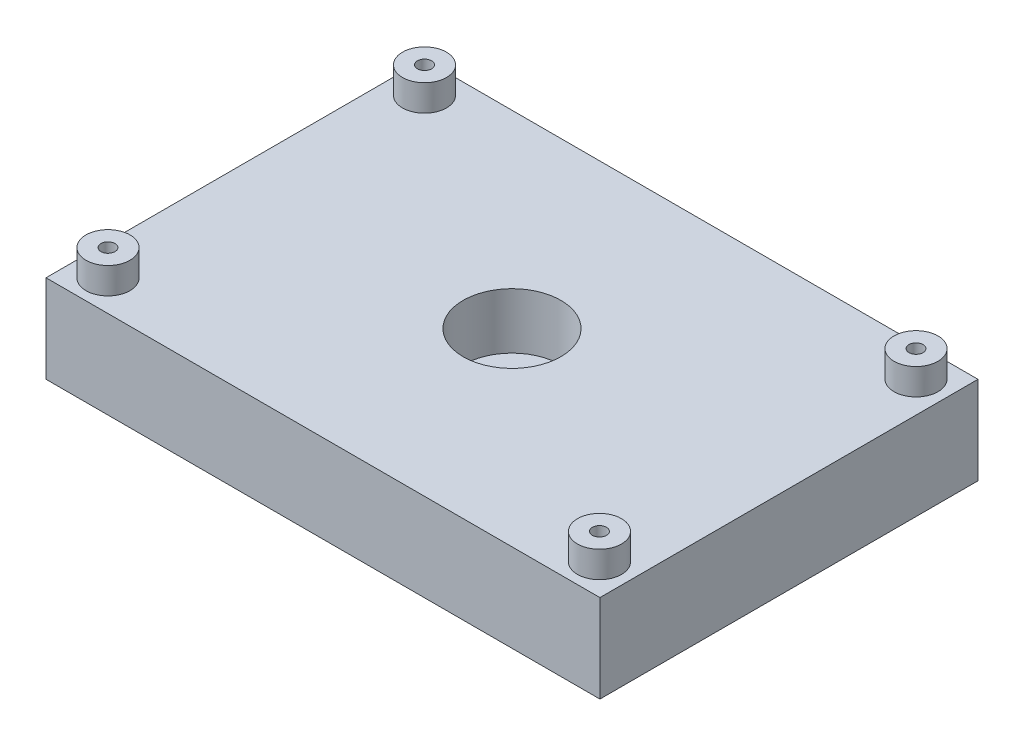
ISO-10303-21;
HEADER;
FILE_DESCRIPTION(('STEP AP214'),'2;1');
FILE_NAME('part.step','',(''),(''),'','','');
FILE_SCHEMA(('AUTOMOTIVE_DESIGN { 1 0 10303 214 1 1 1 1 }'));
ENDSEC;
DATA;
#1=APPLICATION_CONTEXT('core data for automotive mechanical design processes');
#2=APPLICATION_PROTOCOL_DEFINITION('international standard','automotive_design',2000,#1);
#3=PRODUCT_CONTEXT('',#1,'mechanical');
#4=PRODUCT('Part','Part','',(#3));
#5=PRODUCT_RELATED_PRODUCT_CATEGORY('part','',(#4));
#6=PRODUCT_DEFINITION_FORMATION('','',#4);
#7=PRODUCT_DEFINITION_CONTEXT('part definition',#1,'design');
#8=PRODUCT_DEFINITION('design','',#6,#7);
#9=PRODUCT_DEFINITION_SHAPE('','',#8);
#10=(LENGTH_UNIT() NAMED_UNIT(*) SI_UNIT(.MILLI.,.METRE.));
#11=(NAMED_UNIT(*) PLANE_ANGLE_UNIT() SI_UNIT($,.RADIAN.));
#12=(NAMED_UNIT(*) SI_UNIT($,.STERADIAN.) SOLID_ANGLE_UNIT());
#13=UNCERTAINTY_MEASURE_WITH_UNIT(LENGTH_MEASURE(1.E-05),#10,'distance_accuracy_value','');
#14=(GEOMETRIC_REPRESENTATION_CONTEXT(3) GLOBAL_UNCERTAINTY_ASSIGNED_CONTEXT((#13)) GLOBAL_UNIT_ASSIGNED_CONTEXT((#10,
#11,#12)) REPRESENTATION_CONTEXT('',''));
#15=CARTESIAN_POINT('',(0.,0.,0.));
#16=DIRECTION('',(0.,0.,1.));
#17=DIRECTION('',(1.,0.,0.));
#18=AXIS2_PLACEMENT_3D('',#15,#16,#17);
#19=CARTESIAN_POINT('',(-31.5,10.,-21.5));
#20=DIRECTION('',(1.,0.,0.));
#21=DIRECTION('',(0.,0.,-1.));
#22=AXIS2_PLACEMENT_3D('',#19,#20,#21);
#23=PLANE('',#22);
#24=DIRECTION('',(0.,0.,1.));
#25=VECTOR('',#24,1.);
#26=CARTESIAN_POINT('',(-31.5,0.,-21.5));
#27=LINE('',#26,#25);
#28=CARTESIAN_POINT('',(-31.5,0.,-21.5));
#29=VERTEX_POINT('',#28);
#30=CARTESIAN_POINT('',(-31.5,0.,21.5));
#31=VERTEX_POINT('',#30);
#32=EDGE_CURVE('E115',#29,#31,#27,.T.);
#33=ORIENTED_EDGE('',*,*,#32,.T.);
#34=DIRECTION('',(0.,-1.,0.));
#35=VECTOR('',#34,1.);
#36=CARTESIAN_POINT('',(-31.5,10.,21.5));
#37=LINE('',#36,#35);
#38=CARTESIAN_POINT('',(-31.5,10.,21.5));
#39=VERTEX_POINT('',#38);
#40=EDGE_CURVE('E104',#39,#31,#37,.T.);
#41=ORIENTED_EDGE('',*,*,#40,.F.);
#42=DIRECTION('',(0.,0.,1.));
#43=VECTOR('',#42,1.);
#44=CARTESIAN_POINT('',(-31.5,10.,-21.5));
#45=LINE('',#44,#43);
#46=CARTESIAN_POINT('',(-31.5,10.,-21.5));
#47=VERTEX_POINT('',#46);
#48=EDGE_CURVE('E96',#47,#39,#45,.T.);
#49=ORIENTED_EDGE('',*,*,#48,.F.);
#50=DIRECTION('',(0.,-1.,0.));
#51=VECTOR('',#50,1.);
#52=CARTESIAN_POINT('',(-31.5,10.,-21.5));
#53=LINE('',#52,#51);
#54=EDGE_CURVE('E111',#47,#29,#53,.T.);
#55=ORIENTED_EDGE('',*,*,#54,.T.);
#56=EDGE_LOOP('',(#33,#41,#49,#55));
#57=FACE_BOUND('',#56,.T.);
#58=ADVANCED_FACE('F43',(#57),#23,.F.);
#59=CARTESIAN_POINT('',(31.5,10.,21.5));
#60=DIRECTION('',(0.,0.,-1.));
#61=DIRECTION('',(-1.,0.,0.));
#62=AXIS2_PLACEMENT_3D('',#59,#60,#61);
#63=PLANE('',#62);
#64=DIRECTION('',(1.,0.,0.));
#65=VECTOR('',#64,1.);
#66=CARTESIAN_POINT('',(31.5,0.,21.5));
#67=LINE('',#66,#65);
#68=CARTESIAN_POINT('',(31.5,0.,21.5));
#69=VERTEX_POINT('',#68);
#70=EDGE_CURVE('E102',#31,#69,#67,.T.);
#71=ORIENTED_EDGE('',*,*,#70,.T.);
#72=DIRECTION('',(0.,-1.,0.));
#73=VECTOR('',#72,1.);
#74=CARTESIAN_POINT('',(31.5,10.,21.5));
#75=LINE('',#74,#73);
#76=CARTESIAN_POINT('',(31.5,10.,21.5));
#77=VERTEX_POINT('',#76);
#78=EDGE_CURVE('E100',#77,#69,#75,.T.);
#79=ORIENTED_EDGE('',*,*,#78,.F.);
#80=DIRECTION('',(1.,0.,0.));
#81=VECTOR('',#80,1.);
#82=CARTESIAN_POINT('',(31.5,10.,21.5));
#83=LINE('',#82,#81);
#84=EDGE_CURVE('E91',#39,#77,#83,.T.);
#85=ORIENTED_EDGE('',*,*,#84,.F.);
#86=ORIENTED_EDGE('',*,*,#40,.T.);
#87=EDGE_LOOP('',(#71,#79,#85,#86));
#88=FACE_BOUND('',#87,.T.);
#89=ADVANCED_FACE('F101',(#88),#63,.F.);
#90=CARTESIAN_POINT('',(31.5,10.,-21.5));
#91=DIRECTION('',(-1.,0.,0.));
#92=DIRECTION('',(0.,0.,1.));
#93=AXIS2_PLACEMENT_3D('',#90,#91,#92);
#94=PLANE('',#93);
#95=DIRECTION('',(0.,0.,-1.));
#96=VECTOR('',#95,1.);
#97=CARTESIAN_POINT('',(31.5,0.,-21.5));
#98=LINE('',#97,#96);
#99=CARTESIAN_POINT('',(31.5,0.,-21.5));
#100=VERTEX_POINT('',#99);
#101=EDGE_CURVE('E77',#69,#100,#98,.T.);
#102=ORIENTED_EDGE('',*,*,#101,.T.);
#103=DIRECTION('',(0.,-1.,0.));
#104=VECTOR('',#103,1.);
#105=CARTESIAN_POINT('',(31.5,10.,-21.5));
#106=LINE('',#105,#104);
#107=CARTESIAN_POINT('',(31.5,10.,-21.5));
#108=VERTEX_POINT('',#107);
#109=EDGE_CURVE('E105',#108,#100,#106,.T.);
#110=ORIENTED_EDGE('',*,*,#109,.F.);
#111=DIRECTION('',(0.,0.,-1.));
#112=VECTOR('',#111,1.);
#113=CARTESIAN_POINT('',(31.5,10.,-21.5));
#114=LINE('',#113,#112);
#115=EDGE_CURVE('E94',#77,#108,#114,.T.);
#116=ORIENTED_EDGE('',*,*,#115,.F.);
#117=ORIENTED_EDGE('',*,*,#78,.T.);
#118=EDGE_LOOP('',(#102,#110,#116,#117));
#119=FACE_BOUND('',#118,.T.);
#120=ADVANCED_FACE('F107',(#119),#94,.F.);
#121=CARTESIAN_POINT('',(31.5,10.,-21.5));
#122=DIRECTION('',(0.,0.,1.));
#123=DIRECTION('',(1.,0.,0.));
#124=AXIS2_PLACEMENT_3D('',#121,#122,#123);
#125=PLANE('',#124);
#126=DIRECTION('',(-1.,0.,0.));
#127=VECTOR('',#126,1.);
#128=CARTESIAN_POINT('',(31.5,0.,-21.5));
#129=LINE('',#128,#127);
#130=EDGE_CURVE('E83',#100,#29,#129,.T.);
#131=ORIENTED_EDGE('',*,*,#130,.T.);
#132=ORIENTED_EDGE('',*,*,#54,.F.);
#133=DIRECTION('',(-1.,0.,0.));
#134=VECTOR('',#133,1.);
#135=CARTESIAN_POINT('',(31.5,10.,-21.5));
#136=LINE('',#135,#134);
#137=EDGE_CURVE('E60',#108,#47,#136,.T.);
#138=ORIENTED_EDGE('',*,*,#137,.F.);
#139=ORIENTED_EDGE('',*,*,#109,.T.);
#140=EDGE_LOOP('',(#131,#132,#138,#139));
#141=FACE_BOUND('',#140,.T.);
#142=ADVANCED_FACE('F148',(#141),#125,.F.);
#143=CARTESIAN_POINT('',(0.,10.,0.));
#144=DIRECTION('',(0.,-1.,0.));
#145=DIRECTION('',(0.,0.,-1.));
#146=AXIS2_PLACEMENT_3D('',#143,#144,#145);
#147=PLANE('',#146);
#148=CARTESIAN_POINT('',(-27.95,10.,18.));
#149=DIRECTION('',(0.,-1.,0.));
#150=DIRECTION('',(0.,0.,-1.));
#151=AXIS2_PLACEMENT_3D('',#148,#149,#150);
#152=CIRCLE('',#151,2.5);
#153=CARTESIAN_POINT('',(-27.95,10.,15.5));
#154=VERTEX_POINT('',#153);
#155=EDGE_CURVE('E11',#154,#154,#152,.F.);
#156=ORIENTED_EDGE('',*,*,#155,.F.);
#157=EDGE_LOOP('',(#156));
#158=FACE_BOUND('',#157,.T.);
#159=CARTESIAN_POINT('',(27.95,10.,18.));
#160=DIRECTION('',(0.,-1.,0.));
#161=DIRECTION('',(0.,0.,-1.));
#162=AXIS2_PLACEMENT_3D('',#159,#160,#161);
#163=CIRCLE('',#162,2.5);
#164=CARTESIAN_POINT('',(27.95,10.,15.5));
#165=VERTEX_POINT('',#164);
#166=EDGE_CURVE('E52',#165,#165,#163,.F.);
#167=ORIENTED_EDGE('',*,*,#166,.F.);
#168=EDGE_LOOP('',(#167));
#169=FACE_BOUND('',#168,.T.);
#170=CARTESIAN_POINT('',(27.95,10.,-18.));
#171=DIRECTION('',(0.,-1.,0.));
#172=DIRECTION('',(0.,0.,-1.));
#173=AXIS2_PLACEMENT_3D('',#170,#171,#172);
#174=CIRCLE('',#173,2.5);
#175=CARTESIAN_POINT('',(27.95,10.,-20.5));
#176=VERTEX_POINT('',#175);
#177=EDGE_CURVE('E136',#176,#176,#174,.F.);
#178=ORIENTED_EDGE('',*,*,#177,.F.);
#179=EDGE_LOOP('',(#178));
#180=FACE_BOUND('',#179,.T.);
#181=CARTESIAN_POINT('',(-27.95,10.,-18.));
#182=DIRECTION('',(0.,-1.,0.));
#183=DIRECTION('',(0.,0.,-1.));
#184=AXIS2_PLACEMENT_3D('',#181,#182,#183);
#185=CIRCLE('',#184,2.5);
#186=CARTESIAN_POINT('',(-27.95,10.,-20.5));
#187=VERTEX_POINT('',#186);
#188=EDGE_CURVE('E132',#187,#187,#185,.F.);
#189=ORIENTED_EDGE('',*,*,#188,.F.);
#190=EDGE_LOOP('',(#189));
#191=FACE_BOUND('',#190,.T.);
#192=CARTESIAN_POINT('',(0.,10.,0.));
#193=DIRECTION('',(0.,1.,0.));
#194=DIRECTION('',(0.,0.,1.));
#195=AXIS2_PLACEMENT_3D('',#192,#193,#194);
#196=CIRCLE('',#195,5.55625);
#197=CARTESIAN_POINT('',(0.,10.,5.55625));
#198=VERTEX_POINT('',#197);
#199=EDGE_CURVE('E157',#198,#198,#196,.T.);
#200=ORIENTED_EDGE('',*,*,#199,.F.);
#201=EDGE_LOOP('',(#200));
#202=FACE_BOUND('',#201,.T.);
#203=ORIENTED_EDGE('',*,*,#48,.T.);
#204=ORIENTED_EDGE('',*,*,#84,.T.);
#205=ORIENTED_EDGE('',*,*,#115,.T.);
#206=ORIENTED_EDGE('',*,*,#137,.T.);
#207=EDGE_LOOP('',(#203,#204,#205,#206));
#208=FACE_BOUND('',#207,.T.);
#209=ADVANCED_FACE('F92',(#158,#169,#180,#191,#202,#208),#147,.F.);
#210=CARTESIAN_POINT('',(0.,0.,0.));
#211=DIRECTION('',(0.,-1.,0.));
#212=DIRECTION('',(0.,0.,-1.));
#213=AXIS2_PLACEMENT_3D('',#210,#211,#212);
#214=PLANE('',#213);
#215=CARTESIAN_POINT('',(-27.95,0.,-18.));
#216=DIRECTION('',(0.,1.,0.));
#217=DIRECTION('',(0.,0.,1.));
#218=AXIS2_PLACEMENT_3D('',#215,#216,#217);
#219=CIRCLE('',#218,0.799999999999999);
#220=CARTESIAN_POINT('',(-27.95,0.,-17.2));
#221=VERTEX_POINT('',#220);
#222=EDGE_CURVE('E384',#221,#221,#219,.T.);
#223=ORIENTED_EDGE('',*,*,#222,.T.);
#224=EDGE_LOOP('',(#223));
#225=FACE_BOUND('',#224,.T.);
#226=CARTESIAN_POINT('',(27.95,0.,-18.));
#227=DIRECTION('',(0.,1.,0.));
#228=DIRECTION('',(0.,0.,1.));
#229=AXIS2_PLACEMENT_3D('',#226,#227,#228);
#230=CIRCLE('',#229,0.799999999999999);
#231=CARTESIAN_POINT('',(27.95,0.,-17.2));
#232=VERTEX_POINT('',#231);
#233=EDGE_CURVE('E397',#232,#232,#230,.T.);
#234=ORIENTED_EDGE('',*,*,#233,.T.);
#235=EDGE_LOOP('',(#234));
#236=FACE_BOUND('',#235,.T.);
#237=CARTESIAN_POINT('',(27.95,0.,18.));
#238=DIRECTION('',(0.,1.,0.));
#239=DIRECTION('',(0.,0.,1.));
#240=AXIS2_PLACEMENT_3D('',#237,#238,#239);
#241=CIRCLE('',#240,0.799999999999995);
#242=CARTESIAN_POINT('',(27.95,0.,18.8));
#243=VERTEX_POINT('',#242);
#244=EDGE_CURVE('E405',#243,#243,#241,.T.);
#245=ORIENTED_EDGE('',*,*,#244,.T.);
#246=EDGE_LOOP('',(#245));
#247=FACE_BOUND('',#246,.T.);
#248=CARTESIAN_POINT('',(-27.95,0.,18.));
#249=DIRECTION('',(0.,1.,0.));
#250=DIRECTION('',(0.,0.,1.));
#251=AXIS2_PLACEMENT_3D('',#248,#249,#250);
#252=CIRCLE('',#251,0.799999999999995);
#253=CARTESIAN_POINT('',(-27.95,0.,18.8));
#254=VERTEX_POINT('',#253);
#255=EDGE_CURVE('E413',#254,#254,#252,.T.);
#256=ORIENTED_EDGE('',*,*,#255,.T.);
#257=EDGE_LOOP('',(#256));
#258=FACE_BOUND('',#257,.T.);
#259=CARTESIAN_POINT('',(0.,0.,0.));
#260=DIRECTION('',(0.,1.,0.));
#261=DIRECTION('',(0.,0.,1.));
#262=AXIS2_PLACEMENT_3D('',#259,#260,#261);
#263=CIRCLE('',#262,3.3782);
#264=CARTESIAN_POINT('',(0.,0.,3.3782));
#265=VERTEX_POINT('',#264);
#266=EDGE_CURVE('E119',#265,#265,#263,.T.);
#267=ORIENTED_EDGE('',*,*,#266,.T.);
#268=EDGE_LOOP('',(#267));
#269=FACE_BOUND('',#268,.T.);
#270=ORIENTED_EDGE('',*,*,#32,.F.);
#271=ORIENTED_EDGE('',*,*,#130,.F.);
#272=ORIENTED_EDGE('',*,*,#101,.F.);
#273=ORIENTED_EDGE('',*,*,#70,.F.);
#274=EDGE_LOOP('',(#270,#271,#272,#273));
#275=FACE_BOUND('',#274,.T.);
#276=ADVANCED_FACE('F147',(#225,#236,#247,#258,#269,#275),#214,.T.);
#277=CARTESIAN_POINT('',(0.,10.,0.));
#278=DIRECTION('',(0.,1.,0.));
#279=DIRECTION('',(0.,0.,1.));
#280=AXIS2_PLACEMENT_3D('',#277,#278,#279);
#281=CYLINDRICAL_SURFACE('',#280,3.3782);
#282=ORIENTED_EDGE('',*,*,#266,.F.);
#283=EDGE_LOOP('',(#282));
#284=FACE_BOUND('',#283,.T.);
#285=CARTESIAN_POINT('',(0.,3.65,0.));
#286=DIRECTION('',(0.,1.,0.));
#287=DIRECTION('',(0.,0.,1.));
#288=AXIS2_PLACEMENT_3D('',#285,#286,#287);
#289=CIRCLE('',#288,3.3782);
#290=CARTESIAN_POINT('',(0.,3.65,3.3782));
#291=VERTEX_POINT('',#290);
#292=EDGE_CURVE('E166',#291,#291,#289,.T.);
#293=ORIENTED_EDGE('',*,*,#292,.T.);
#294=EDGE_LOOP('',(#293));
#295=FACE_BOUND('',#294,.T.);
#296=ADVANCED_FACE('F183',(#284,#295),#281,.F.);
#297=CARTESIAN_POINT('',(3.3782,3.65,0.));
#298=DIRECTION('',(0.,-1.,0.));
#299=DIRECTION('',(0.,0.,-1.));
#300=AXIS2_PLACEMENT_3D('',#297,#298,#299);
#301=PLANE('',#300);
#302=ORIENTED_EDGE('',*,*,#292,.F.);
#303=EDGE_LOOP('',(#302));
#304=FACE_BOUND('',#303,.T.);
#305=CARTESIAN_POINT('',(0.,3.65,0.));
#306=DIRECTION('',(0.,1.,0.));
#307=DIRECTION('',(0.,0.,1.));
#308=AXIS2_PLACEMENT_3D('',#305,#306,#307);
#309=CIRCLE('',#308,5.55625);
#310=CARTESIAN_POINT('',(0.,3.65,5.55625));
#311=VERTEX_POINT('',#310);
#312=EDGE_CURVE('E160',#311,#311,#309,.T.);
#313=ORIENTED_EDGE('',*,*,#312,.T.);
#314=EDGE_LOOP('',(#313));
#315=FACE_BOUND('',#314,.T.);
#316=ADVANCED_FACE('F186',(#304,#315),#301,.F.);
#317=CARTESIAN_POINT('',(0.,10.,0.));
#318=DIRECTION('',(0.,1.,0.));
#319=DIRECTION('',(0.,0.,1.));
#320=AXIS2_PLACEMENT_3D('',#317,#318,#319);
#321=CYLINDRICAL_SURFACE('',#320,5.55625);
#322=ORIENTED_EDGE('',*,*,#312,.F.);
#323=EDGE_LOOP('',(#322));
#324=FACE_BOUND('',#323,.T.);
#325=ORIENTED_EDGE('',*,*,#199,.T.);
#326=EDGE_LOOP('',(#325));
#327=FACE_BOUND('',#326,.T.);
#328=ADVANCED_FACE('F192',(#324,#327),#321,.F.);
#329=CARTESIAN_POINT('',(-27.95,13.,-18.));
#330=DIRECTION('',(0.,-1.,0.));
#331=DIRECTION('',(0.,0.,-1.));
#332=AXIS2_PLACEMENT_3D('',#329,#330,#331);
#333=CYLINDRICAL_SURFACE('',#332,2.5);
#334=CARTESIAN_POINT('',(-27.95,13.,-18.));
#335=DIRECTION('',(0.,1.,0.));
#336=DIRECTION('',(0.,0.,1.));
#337=AXIS2_PLACEMENT_3D('',#334,#335,#336);
#338=CIRCLE('',#337,2.5);
#339=CARTESIAN_POINT('',(-27.95,13.,-15.5));
#340=VERTEX_POINT('',#339);
#341=EDGE_CURVE('E161',#340,#340,#338,.T.);
#342=ORIENTED_EDGE('',*,*,#341,.F.);
#343=EDGE_LOOP('',(#342));
#344=FACE_BOUND('',#343,.T.);
#345=ORIENTED_EDGE('',*,*,#188,.T.);
#346=EDGE_LOOP('',(#345));
#347=FACE_BOUND('',#346,.T.);
#348=ADVANCED_FACE('F197',(#344,#347),#333,.T.);
#349=CARTESIAN_POINT('',(-27.95,13.,-18.));
#350=DIRECTION('',(0.,1.,0.));
#351=DIRECTION('',(0.,0.,1.));
#352=AXIS2_PLACEMENT_3D('',#349,#350,#351);
#353=PLANE('',#352);
#354=CARTESIAN_POINT('',(-27.95,13.,-18.));
#355=DIRECTION('',(0.,1.,0.));
#356=DIRECTION('',(0.,0.,1.));
#357=AXIS2_PLACEMENT_3D('',#354,#355,#356);
#358=CIRCLE('',#357,0.799999999999999);
#359=CARTESIAN_POINT('',(-27.95,13.,-17.2));
#360=VERTEX_POINT('',#359);
#361=EDGE_CURVE('E387',#360,#360,#358,.T.);
#362=ORIENTED_EDGE('',*,*,#361,.F.);
#363=EDGE_LOOP('',(#362));
#364=FACE_BOUND('',#363,.T.);
#365=ORIENTED_EDGE('',*,*,#341,.T.);
#366=EDGE_LOOP('',(#365));
#367=FACE_BOUND('',#366,.T.);
#368=ADVANCED_FACE('F202',(#364,#367),#353,.T.);
#369=CARTESIAN_POINT('',(27.95,13.,-18.));
#370=DIRECTION('',(0.,-1.,0.));
#371=DIRECTION('',(0.,0.,-1.));
#372=AXIS2_PLACEMENT_3D('',#369,#370,#371);
#373=CYLINDRICAL_SURFACE('',#372,2.5);
#374=CARTESIAN_POINT('',(27.95,13.,-18.));
#375=DIRECTION('',(0.,1.,0.));
#376=DIRECTION('',(0.,0.,1.));
#377=AXIS2_PLACEMENT_3D('',#374,#375,#376);
#378=CIRCLE('',#377,2.5);
#379=CARTESIAN_POINT('',(27.95,13.,-15.5));
#380=VERTEX_POINT('',#379);
#381=EDGE_CURVE('E169',#380,#380,#378,.T.);
#382=ORIENTED_EDGE('',*,*,#381,.F.);
#383=EDGE_LOOP('',(#382));
#384=FACE_BOUND('',#383,.T.);
#385=ORIENTED_EDGE('',*,*,#177,.T.);
#386=EDGE_LOOP('',(#385));
#387=FACE_BOUND('',#386,.T.);
#388=ADVANCED_FACE('F252',(#384,#387),#373,.T.);
#389=CARTESIAN_POINT('',(27.95,13.,-18.));
#390=DIRECTION('',(0.,1.,0.));
#391=DIRECTION('',(0.,0.,1.));
#392=AXIS2_PLACEMENT_3D('',#389,#390,#391);
#393=PLANE('',#392);
#394=CARTESIAN_POINT('',(27.95,13.,-18.));
#395=DIRECTION('',(0.,1.,0.));
#396=DIRECTION('',(0.,0.,1.));
#397=AXIS2_PLACEMENT_3D('',#394,#395,#396);
#398=CIRCLE('',#397,0.799999999999999);
#399=CARTESIAN_POINT('',(27.95,13.,-17.2));
#400=VERTEX_POINT('',#399);
#401=EDGE_CURVE('E391',#400,#400,#398,.T.);
#402=ORIENTED_EDGE('',*,*,#401,.F.);
#403=EDGE_LOOP('',(#402));
#404=FACE_BOUND('',#403,.T.);
#405=ORIENTED_EDGE('',*,*,#381,.T.);
#406=EDGE_LOOP('',(#405));
#407=FACE_BOUND('',#406,.T.);
#408=ADVANCED_FACE('F257',(#404,#407),#393,.T.);
#409=CARTESIAN_POINT('',(27.95,13.,18.));
#410=DIRECTION('',(0.,-1.,0.));
#411=DIRECTION('',(0.,0.,-1.));
#412=AXIS2_PLACEMENT_3D('',#409,#410,#411);
#413=CYLINDRICAL_SURFACE('',#412,2.5);
#414=CARTESIAN_POINT('',(27.95,13.,18.));
#415=DIRECTION('',(0.,1.,0.));
#416=DIRECTION('',(0.,0.,1.));
#417=AXIS2_PLACEMENT_3D('',#414,#415,#416);
#418=CIRCLE('',#417,2.5);
#419=CARTESIAN_POINT('',(27.95,13.,20.5));
#420=VERTEX_POINT('',#419);
#421=EDGE_CURVE('E421',#420,#420,#418,.T.);
#422=ORIENTED_EDGE('',*,*,#421,.F.);
#423=EDGE_LOOP('',(#422));
#424=FACE_BOUND('',#423,.T.);
#425=ORIENTED_EDGE('',*,*,#166,.T.);
#426=EDGE_LOOP('',(#425));
#427=FACE_BOUND('',#426,.T.);
#428=ADVANCED_FACE('F143',(#424,#427),#413,.T.);
#429=CARTESIAN_POINT('',(27.95,13.,18.));
#430=DIRECTION('',(0.,1.,0.));
#431=DIRECTION('',(0.,0.,1.));
#432=AXIS2_PLACEMENT_3D('',#429,#430,#431);
#433=PLANE('',#432);
#434=CARTESIAN_POINT('',(27.95,13.,18.));
#435=DIRECTION('',(0.,1.,0.));
#436=DIRECTION('',(0.,0.,1.));
#437=AXIS2_PLACEMENT_3D('',#434,#435,#436);
#438=CIRCLE('',#437,0.799999999999999);
#439=CARTESIAN_POINT('',(27.95,13.,18.8));
#440=VERTEX_POINT('',#439);
#441=EDGE_CURVE('E401',#440,#440,#438,.T.);
#442=ORIENTED_EDGE('',*,*,#441,.F.);
#443=EDGE_LOOP('',(#442));
#444=FACE_BOUND('',#443,.T.);
#445=ORIENTED_EDGE('',*,*,#421,.T.);
#446=EDGE_LOOP('',(#445));
#447=FACE_BOUND('',#446,.T.);
#448=ADVANCED_FACE('F269',(#444,#447),#433,.T.);
#449=CARTESIAN_POINT('',(-27.95,13.,18.));
#450=DIRECTION('',(0.,-1.,0.));
#451=DIRECTION('',(0.,0.,-1.));
#452=AXIS2_PLACEMENT_3D('',#449,#450,#451);
#453=CYLINDRICAL_SURFACE('',#452,2.5);
#454=CARTESIAN_POINT('',(-27.95,13.,18.));
#455=DIRECTION('',(0.,1.,0.));
#456=DIRECTION('',(0.,0.,1.));
#457=AXIS2_PLACEMENT_3D('',#454,#455,#456);
#458=CIRCLE('',#457,2.5);
#459=CARTESIAN_POINT('',(-27.95,13.,20.5));
#460=VERTEX_POINT('',#459);
#461=EDGE_CURVE('E417',#460,#460,#458,.T.);
#462=ORIENTED_EDGE('',*,*,#461,.F.);
#463=EDGE_LOOP('',(#462));
#464=FACE_BOUND('',#463,.T.);
#465=ORIENTED_EDGE('',*,*,#155,.T.);
#466=EDGE_LOOP('',(#465));
#467=FACE_BOUND('',#466,.T.);
#468=ADVANCED_FACE('F277',(#464,#467),#453,.T.);
#469=CARTESIAN_POINT('',(-27.95,13.,18.));
#470=DIRECTION('',(0.,1.,0.));
#471=DIRECTION('',(0.,0.,1.));
#472=AXIS2_PLACEMENT_3D('',#469,#470,#471);
#473=PLANE('',#472);
#474=CARTESIAN_POINT('',(-27.95,13.,18.));
#475=DIRECTION('',(0.,1.,0.));
#476=DIRECTION('',(0.,0.,1.));
#477=AXIS2_PLACEMENT_3D('',#474,#475,#476);
#478=CIRCLE('',#477,0.799999999999999);
#479=CARTESIAN_POINT('',(-27.95,13.,18.8));
#480=VERTEX_POINT('',#479);
#481=EDGE_CURVE('E409',#480,#480,#478,.T.);
#482=ORIENTED_EDGE('',*,*,#481,.F.);
#483=EDGE_LOOP('',(#482));
#484=FACE_BOUND('',#483,.T.);
#485=ORIENTED_EDGE('',*,*,#461,.T.);
#486=EDGE_LOOP('',(#485));
#487=FACE_BOUND('',#486,.T.);
#488=ADVANCED_FACE('F281',(#484,#487),#473,.T.);
#489=CARTESIAN_POINT('',(-27.95,13.,18.));
#490=DIRECTION('',(0.,1.,0.));
#491=DIRECTION('',(0.,0.,1.));
#492=AXIS2_PLACEMENT_3D('',#489,#490,#491);
#493=CYLINDRICAL_SURFACE('',#492,0.799999999999997);
#494=ORIENTED_EDGE('',*,*,#255,.F.);
#495=EDGE_LOOP('',(#494));
#496=FACE_BOUND('',#495,.T.);
#497=ORIENTED_EDGE('',*,*,#481,.T.);
#498=EDGE_LOOP('',(#497));
#499=FACE_BOUND('',#498,.T.);
#500=ADVANCED_FACE('F324',(#496,#499),#493,.F.);
#501=CARTESIAN_POINT('',(27.95,13.,18.));
#502=DIRECTION('',(0.,1.,0.));
#503=DIRECTION('',(0.,0.,1.));
#504=AXIS2_PLACEMENT_3D('',#501,#502,#503);
#505=CYLINDRICAL_SURFACE('',#504,0.799999999999997);
#506=ORIENTED_EDGE('',*,*,#244,.F.);
#507=EDGE_LOOP('',(#506));
#508=FACE_BOUND('',#507,.T.);
#509=ORIENTED_EDGE('',*,*,#441,.T.);
#510=EDGE_LOOP('',(#509));
#511=FACE_BOUND('',#510,.T.);
#512=ADVANCED_FACE('F336',(#508,#511),#505,.F.);
#513=CARTESIAN_POINT('',(27.95,13.,-18.));
#514=DIRECTION('',(0.,1.,0.));
#515=DIRECTION('',(0.,0.,1.));
#516=AXIS2_PLACEMENT_3D('',#513,#514,#515);
#517=CYLINDRICAL_SURFACE('',#516,0.799999999999999);
#518=ORIENTED_EDGE('',*,*,#233,.F.);
#519=EDGE_LOOP('',(#518));
#520=FACE_BOUND('',#519,.T.);
#521=ORIENTED_EDGE('',*,*,#401,.T.);
#522=EDGE_LOOP('',(#521));
#523=FACE_BOUND('',#522,.T.);
#524=ADVANCED_FACE('F347',(#520,#523),#517,.F.);
#525=CARTESIAN_POINT('',(-27.95,13.,-18.));
#526=DIRECTION('',(0.,1.,0.));
#527=DIRECTION('',(0.,0.,1.));
#528=AXIS2_PLACEMENT_3D('',#525,#526,#527);
#529=CYLINDRICAL_SURFACE('',#528,0.799999999999999);
#530=ORIENTED_EDGE('',*,*,#222,.F.);
#531=EDGE_LOOP('',(#530));
#532=FACE_BOUND('',#531,.T.);
#533=ORIENTED_EDGE('',*,*,#361,.T.);
#534=EDGE_LOOP('',(#533));
#535=FACE_BOUND('',#534,.T.);
#536=ADVANCED_FACE('F358',(#532,#535),#529,.F.);
#537=CLOSED_SHELL('',(#58,#89,#120,#142,#209,#276,#296,#316,#328,#348,#368,#388,#408,#428,#448,
#468,#488,#500,#512,#524,#536));
#538=MANIFOLD_SOLID_BREP('B2',#537);
#539=ADVANCED_BREP_SHAPE_REPRESENTATION('',(#18,#538),#14);
#540=SHAPE_DEFINITION_REPRESENTATION(#9,#539);
ENDSEC;
END-ISO-10303-21;
